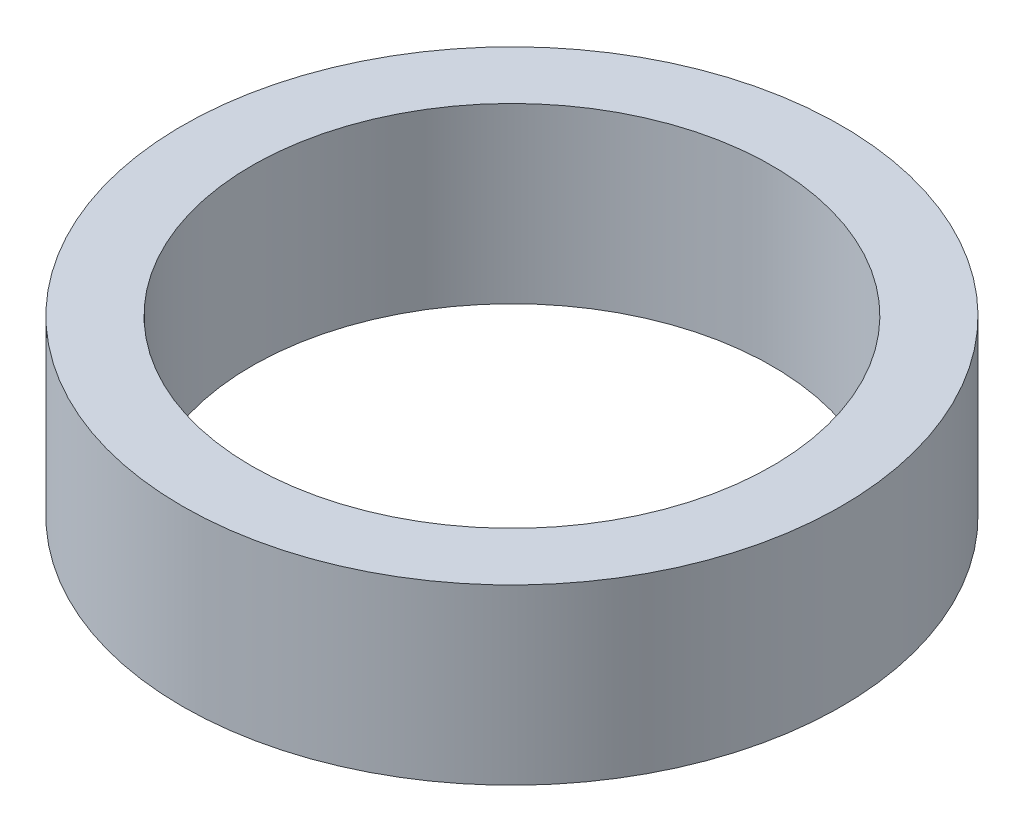
ISO-10303-21;
HEADER;
FILE_DESCRIPTION(('STEP AP214'),'2;1');
FILE_NAME('part.step','',(''),(''),'','','');
FILE_SCHEMA(('AUTOMOTIVE_DESIGN { 1 0 10303 214 1 1 1 1 }'));
ENDSEC;
DATA;
#1=APPLICATION_CONTEXT('core data for automotive mechanical design processes');
#2=APPLICATION_PROTOCOL_DEFINITION('international standard','automotive_design',2000,#1);
#3=PRODUCT_CONTEXT('',#1,'mechanical');
#4=PRODUCT('Part','Part','',(#3));
#5=PRODUCT_RELATED_PRODUCT_CATEGORY('part','',(#4));
#6=PRODUCT_DEFINITION_FORMATION('','',#4);
#7=PRODUCT_DEFINITION_CONTEXT('part definition',#1,'design');
#8=PRODUCT_DEFINITION('design','',#6,#7);
#9=PRODUCT_DEFINITION_SHAPE('','',#8);
#10=(LENGTH_UNIT() NAMED_UNIT(*) SI_UNIT(.MILLI.,.METRE.));
#11=(NAMED_UNIT(*) PLANE_ANGLE_UNIT() SI_UNIT($,.RADIAN.));
#12=(NAMED_UNIT(*) SI_UNIT($,.STERADIAN.) SOLID_ANGLE_UNIT());
#13=UNCERTAINTY_MEASURE_WITH_UNIT(LENGTH_MEASURE(1.E-05),#10,'distance_accuracy_value','');
#14=(GEOMETRIC_REPRESENTATION_CONTEXT(3) GLOBAL_UNCERTAINTY_ASSIGNED_CONTEXT((#13)) GLOBAL_UNIT_ASSIGNED_CONTEXT((#10,
#11,#12)) REPRESENTATION_CONTEXT('',''));
#15=CARTESIAN_POINT('',(0.,0.,0.));
#16=DIRECTION('',(0.,0.,1.));
#17=DIRECTION('',(1.,0.,0.));
#18=AXIS2_PLACEMENT_3D('',#15,#16,#17);
#19=CARTESIAN_POINT('',(0.,10.,0.));
#20=DIRECTION('',(0.,1.,0.));
#21=DIRECTION('',(0.,0.,1.));
#22=AXIS2_PLACEMENT_3D('',#19,#20,#21);
#23=PLANE('',#22);
#24=CARTESIAN_POINT('',(0.,10.,0.));
#25=DIRECTION('',(0.,1.,0.));
#26=DIRECTION('',(0.,0.,1.));
#27=AXIS2_PLACEMENT_3D('',#24,#25,#26);
#28=CIRCLE('',#27,19.);
#29=CARTESIAN_POINT('',(0.,10.,19.));
#30=VERTEX_POINT('',#29);
#31=EDGE_CURVE('E10',#30,#30,#28,.T.);
#32=ORIENTED_EDGE('',*,*,#31,.T.);
#33=EDGE_LOOP('',(#32));
#34=FACE_BOUND('',#33,.T.);
#35=CARTESIAN_POINT('',(0.,10.,0.));
#36=DIRECTION('',(0.,1.,0.));
#37=DIRECTION('',(0.,0.,1.));
#38=AXIS2_PLACEMENT_3D('',#35,#36,#37);
#39=CIRCLE('',#38,15.);
#40=CARTESIAN_POINT('',(0.,10.,15.));
#41=VERTEX_POINT('',#40);
#42=EDGE_CURVE('E50',#41,#41,#39,.T.);
#43=ORIENTED_EDGE('',*,*,#42,.F.);
#44=EDGE_LOOP('',(#43));
#45=FACE_BOUND('',#44,.T.);
#46=ADVANCED_FACE('F37',(#34,#45),#23,.T.);
#47=CARTESIAN_POINT('',(0.,0.,0.));
#48=DIRECTION('',(0.,1.,0.));
#49=DIRECTION('',(0.,0.,1.));
#50=AXIS2_PLACEMENT_3D('',#47,#48,#49);
#51=PLANE('',#50);
#52=CARTESIAN_POINT('',(0.,0.,0.));
#53=DIRECTION('',(0.,1.,0.));
#54=DIRECTION('',(0.,0.,1.));
#55=AXIS2_PLACEMENT_3D('',#52,#53,#54);
#56=CIRCLE('',#55,19.);
#57=CARTESIAN_POINT('',(0.,0.,19.));
#58=VERTEX_POINT('',#57);
#59=EDGE_CURVE('E41',#58,#58,#56,.T.);
#60=ORIENTED_EDGE('',*,*,#59,.F.);
#61=EDGE_LOOP('',(#60));
#62=FACE_BOUND('',#61,.T.);
#63=CARTESIAN_POINT('',(0.,0.,0.));
#64=DIRECTION('',(0.,1.,0.));
#65=DIRECTION('',(0.,0.,1.));
#66=AXIS2_PLACEMENT_3D('',#63,#64,#65);
#67=CIRCLE('',#66,15.);
#68=CARTESIAN_POINT('',(0.,0.,15.));
#69=VERTEX_POINT('',#68);
#70=EDGE_CURVE('E52',#69,#69,#67,.T.);
#71=ORIENTED_EDGE('',*,*,#70,.T.);
#72=EDGE_LOOP('',(#71));
#73=FACE_BOUND('',#72,.T.);
#74=ADVANCED_FACE('F64',(#62,#73),#51,.F.);
#75=CARTESIAN_POINT('',(0.,10.,0.));
#76=DIRECTION('',(0.,-1.,0.));
#77=DIRECTION('',(0.,0.,-1.));
#78=AXIS2_PLACEMENT_3D('',#75,#76,#77);
#79=CYLINDRICAL_SURFACE('',#78,19.);
#80=ORIENTED_EDGE('',*,*,#31,.F.);
#81=EDGE_LOOP('',(#80));
#82=FACE_BOUND('',#81,.T.);
#83=ORIENTED_EDGE('',*,*,#59,.T.);
#84=EDGE_LOOP('',(#83));
#85=FACE_BOUND('',#84,.T.);
#86=ADVANCED_FACE('F39',(#82,#85),#79,.T.);
#87=CARTESIAN_POINT('',(0.,10.,0.));
#88=DIRECTION('',(0.,-1.,0.));
#89=DIRECTION('',(0.,0.,-1.));
#90=AXIS2_PLACEMENT_3D('',#87,#88,#89);
#91=CYLINDRICAL_SURFACE('',#90,15.);
#92=ORIENTED_EDGE('',*,*,#42,.T.);
#93=EDGE_LOOP('',(#92));
#94=FACE_BOUND('',#93,.T.);
#95=ORIENTED_EDGE('',*,*,#70,.F.);
#96=EDGE_LOOP('',(#95));
#97=FACE_BOUND('',#96,.T.);
#98=ADVANCED_FACE('F60',(#94,#97),#91,.F.);
#99=CLOSED_SHELL('',(#46,#74,#86,#98));
#100=MANIFOLD_SOLID_BREP('B2',#99);
#101=ADVANCED_BREP_SHAPE_REPRESENTATION('',(#18,#100),#14);
#102=SHAPE_DEFINITION_REPRESENTATION(#9,#101);
ENDSEC;
END-ISO-10303-21;
